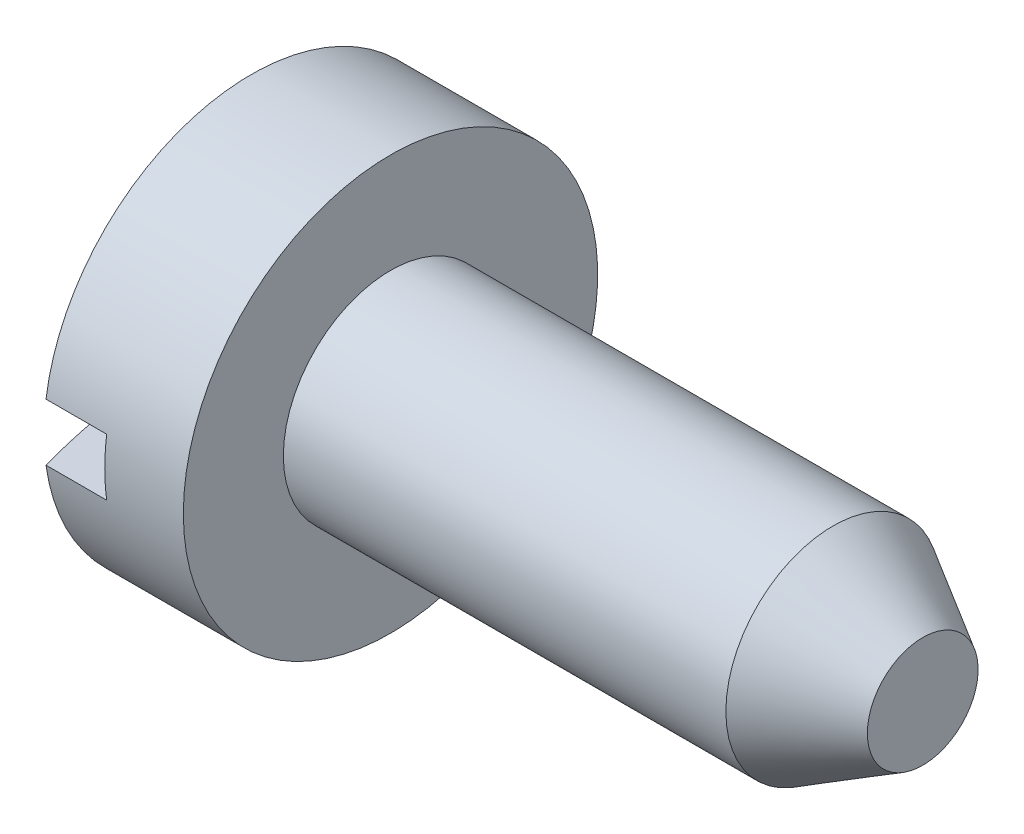
ISO-10303-21;
HEADER;
FILE_DESCRIPTION(('STEP AP214'),'2;1');
FILE_NAME('part.step','',(''),(''),'','','');
FILE_SCHEMA(('AUTOMOTIVE_DESIGN { 1 0 10303 214 1 1 1 1 }'));
ENDSEC;
DATA;
#1=APPLICATION_CONTEXT('core data for automotive mechanical design processes');
#2=APPLICATION_PROTOCOL_DEFINITION('international standard','automotive_design',2000,#1);
#3=PRODUCT_CONTEXT('',#1,'mechanical');
#4=PRODUCT('Part','Part','',(#3));
#5=PRODUCT_RELATED_PRODUCT_CATEGORY('part','',(#4));
#6=PRODUCT_DEFINITION_FORMATION('','',#4);
#7=PRODUCT_DEFINITION_CONTEXT('part definition',#1,'design');
#8=PRODUCT_DEFINITION('design','',#6,#7);
#9=PRODUCT_DEFINITION_SHAPE('','',#8);
#10=(LENGTH_UNIT() NAMED_UNIT(*) SI_UNIT(.MILLI.,.METRE.));
#11=(NAMED_UNIT(*) PLANE_ANGLE_UNIT() SI_UNIT($,.RADIAN.));
#12=(NAMED_UNIT(*) SI_UNIT($,.STERADIAN.) SOLID_ANGLE_UNIT());
#13=UNCERTAINTY_MEASURE_WITH_UNIT(LENGTH_MEASURE(1.E-05),#10,'distance_accuracy_value','');
#14=(GEOMETRIC_REPRESENTATION_CONTEXT(3) GLOBAL_UNCERTAINTY_ASSIGNED_CONTEXT((#13)) GLOBAL_UNIT_ASSIGNED_CONTEXT((#10,
#11,#12)) REPRESENTATION_CONTEXT('',''));
#15=CARTESIAN_POINT('',(0.,0.,0.));
#16=DIRECTION('',(0.,0.,1.));
#17=DIRECTION('',(1.,0.,0.));
#18=AXIS2_PLACEMENT_3D('',#15,#16,#17);
#19=CARTESIAN_POINT('',(0.,0.,0.));
#20=DIRECTION('',(-1.,0.,0.));
#21=DIRECTION('',(0.,0.,1.));
#22=AXIS2_PLACEMENT_3D('',#19,#20,#21);
#23=CYLINDRICAL_SURFACE('',#22,0.762);
#24=CARTESIAN_POINT('',(0.9906,0.,0.));
#25=DIRECTION('',(-1.,0.,0.));
#26=DIRECTION('',(0.,0.,1.));
#27=AXIS2_PLACEMENT_3D('',#24,#25,#26);
#28=CIRCLE('',#27,0.762);
#29=CARTESIAN_POINT('',(0.9906,0.,0.762));
#30=VERTEX_POINT('',#29);
#31=EDGE_CURVE('E130',#30,#30,#28,.T.);
#32=ORIENTED_EDGE('',*,*,#31,.F.);
#33=EDGE_LOOP('',(#32));
#34=FACE_BOUND('',#33,.T.);
#35=CARTESIAN_POINT('',(4.13728568757237,0.,0.));
#36=DIRECTION('',(-1.,0.,0.));
#37=DIRECTION('',(0.,0.,1.));
#38=AXIS2_PLACEMENT_3D('',#35,#36,#37);
#39=CIRCLE('',#38,0.762);
#40=CARTESIAN_POINT('',(4.13728568757237,0.,0.762));
#41=VERTEX_POINT('',#40);
#42=EDGE_CURVE('E180',#41,#41,#39,.T.);
#43=ORIENTED_EDGE('',*,*,#42,.T.);
#44=EDGE_LOOP('',(#43));
#45=FACE_BOUND('',#44,.T.);
#46=ADVANCED_FACE('F68',(#34,#45),#23,.T.);
#47=CARTESIAN_POINT('',(5.23874999999999,0.,0.));
#48=DIRECTION('',(-1.,0.,0.));
#49=DIRECTION('',(0.,1.,0.));
#50=AXIS2_PLACEMENT_3D('',#47,#48,#49);
#51=SPHERICAL_SURFACE('',#50,5.44194999999999);
#52=CARTESIAN_POINT('',(0.,0.,0.));
#53=DIRECTION('',(-1.,0.,0.));
#54=DIRECTION('',(0.,0.,1.));
#55=AXIS2_PLACEMENT_3D('',#52,#53,#54);
#56=CIRCLE('',#55,1.4732);
#57=CARTESIAN_POINT('',(0.,0.2032,1.45911891222066));
#58=VERTEX_POINT('',#57);
#59=CARTESIAN_POINT('',(0.,0.2032,-1.45911891222066));
#60=VERTEX_POINT('',#59);
#61=EDGE_CURVE('E144',#58,#60,#56,.T.);
#62=ORIENTED_EDGE('',*,*,#61,.T.);
#63=CARTESIAN_POINT('',(5.23874999999999,0.2032,0.));
#64=DIRECTION('',(0.,1.,0.));
#65=DIRECTION('',(0.,0.,1.));
#66=AXIS2_PLACEMENT_3D('',#63,#64,#65);
#67=CIRCLE('',#66,5.43815497779347);
#68=EDGE_CURVE('E91',#60,#58,#67,.T.);
#69=ORIENTED_EDGE('',*,*,#68,.T.);
#70=EDGE_LOOP('',(#62,#69));
#71=FACE_BOUND('',#70,.T.);
#72=ADVANCED_FACE('F149',(#71),#51,.T.);
#73=CARTESIAN_POINT('',(0.,-0.2032,-1.45911891222066));
#74=VERTEX_POINT('',#73);
#75=CARTESIAN_POINT('',(0.,-0.2032,1.45911891222066));
#76=VERTEX_POINT('',#75);
#77=EDGE_CURVE('E137',#74,#76,#56,.T.);
#78=ORIENTED_EDGE('',*,*,#77,.T.);
#79=CARTESIAN_POINT('',(5.23874999999999,-0.2032,0.));
#80=DIRECTION('',(0.,-1.,0.));
#81=DIRECTION('',(0.,0.,-1.));
#82=AXIS2_PLACEMENT_3D('',#79,#80,#81);
#83=CIRCLE('',#82,5.43815497779347);
#84=EDGE_CURVE('E110',#76,#74,#83,.T.);
#85=ORIENTED_EDGE('',*,*,#84,.T.);
#86=EDGE_LOOP('',(#78,#85));
#87=FACE_BOUND('',#86,.T.);
#88=ADVANCED_FACE('F70',(#87),#51,.T.);
#89=CARTESIAN_POINT('',(0.9906,0.762,0.));
#90=DIRECTION('',(-1.,0.,0.));
#91=DIRECTION('',(0.,0.,1.));
#92=AXIS2_PLACEMENT_3D('',#89,#90,#91);
#93=PLANE('',#92);
#94=CARTESIAN_POINT('',(0.9906,0.,0.));
#95=DIRECTION('',(-1.,0.,0.));
#96=DIRECTION('',(0.,0.,1.));
#97=AXIS2_PLACEMENT_3D('',#94,#95,#96);
#98=CIRCLE('',#97,1.4732);
#99=CARTESIAN_POINT('',(0.9906,0.,1.4732));
#100=VERTEX_POINT('',#99);
#101=EDGE_CURVE('E133',#100,#100,#98,.T.);
#102=ORIENTED_EDGE('',*,*,#101,.F.);
#103=EDGE_LOOP('',(#102));
#104=FACE_BOUND('',#103,.T.);
#105=ORIENTED_EDGE('',*,*,#31,.T.);
#106=EDGE_LOOP('',(#105));
#107=FACE_BOUND('',#106,.T.);
#108=ADVANCED_FACE('F158',(#104,#107),#93,.F.);
#109=CARTESIAN_POINT('',(0.,0.,0.));
#110=DIRECTION('',(-1.,0.,0.));
#111=DIRECTION('',(0.,0.,1.));
#112=AXIS2_PLACEMENT_3D('',#109,#110,#111);
#113=CYLINDRICAL_SURFACE('',#112,1.4732);
#114=CARTESIAN_POINT('',(0.4318,0.,0.));
#115=DIRECTION('',(1.,0.,0.));
#116=DIRECTION('',(0.,0.,-1.));
#117=AXIS2_PLACEMENT_3D('',#114,#115,#116);
#118=CIRCLE('',#117,1.4732);
#119=CARTESIAN_POINT('',(0.4318,-0.2032,-1.45911891222066));
#120=VERTEX_POINT('',#119);
#121=CARTESIAN_POINT('',(0.4318,0.2032,-1.45911891222066));
#122=VERTEX_POINT('',#121);
#123=EDGE_CURVE('E115',#120,#122,#118,.T.);
#124=ORIENTED_EDGE('',*,*,#123,.T.);
#125=DIRECTION('',(-1.,0.,0.));
#126=VECTOR('',#125,1.);
#127=CARTESIAN_POINT('',(0.,0.2032,-1.45911891222066));
#128=LINE('',#127,#126);
#129=EDGE_CURVE('E42',#122,#60,#128,.T.);
#130=ORIENTED_EDGE('',*,*,#129,.T.);
#131=ORIENTED_EDGE('',*,*,#61,.F.);
#132=DIRECTION('',(-1.,0.,0.));
#133=VECTOR('',#132,1.);
#134=CARTESIAN_POINT('',(0.,0.2032,1.45911891222066));
#135=LINE('',#134,#133);
#136=CARTESIAN_POINT('',(0.4318,0.2032,1.45911891222066));
#137=VERTEX_POINT('',#136);
#138=EDGE_CURVE('E76',#58,#137,#135,.F.);
#139=ORIENTED_EDGE('',*,*,#138,.T.);
#140=CARTESIAN_POINT('',(0.4318,-0.2032,1.45911891222066));
#141=VERTEX_POINT('',#140);
#142=EDGE_CURVE('E116',#137,#141,#118,.T.);
#143=ORIENTED_EDGE('',*,*,#142,.T.);
#144=DIRECTION('',(-1.,0.,0.));
#145=VECTOR('',#144,1.);
#146=CARTESIAN_POINT('',(0.,-0.2032,1.45911891222066));
#147=LINE('',#146,#145);
#148=EDGE_CURVE('E107',#141,#76,#147,.T.);
#149=ORIENTED_EDGE('',*,*,#148,.T.);
#150=ORIENTED_EDGE('',*,*,#77,.F.);
#151=DIRECTION('',(-1.,0.,0.));
#152=VECTOR('',#151,1.);
#153=CARTESIAN_POINT('',(0.,-0.2032,-1.45911891222066));
#154=LINE('',#153,#152);
#155=EDGE_CURVE('E135',#74,#120,#154,.F.);
#156=ORIENTED_EDGE('',*,*,#155,.T.);
#157=EDGE_LOOP('',(#124,#130,#131,#139,#143,#149,#150,#156));
#158=FACE_BOUND('',#157,.T.);
#159=ORIENTED_EDGE('',*,*,#101,.T.);
#160=EDGE_LOOP('',(#159));
#161=FACE_BOUND('',#160,.T.);
#162=ADVANCED_FACE('F127',(#158,#161),#113,.T.);
#163=CARTESIAN_POINT('',(-0.2032,0.2032,-1.4732));
#164=DIRECTION('',(0.,1.,0.));
#165=DIRECTION('',(0.,0.,1.));
#166=AXIS2_PLACEMENT_3D('',#163,#164,#165);
#167=PLANE('',#166);
#168=DIRECTION('',(0.,0.,1.));
#169=VECTOR('',#168,1.);
#170=CARTESIAN_POINT('',(0.4318,0.2032,-1.4732));
#171=LINE('',#170,#169);
#172=EDGE_CURVE('E123',#122,#137,#171,.T.);
#173=ORIENTED_EDGE('',*,*,#172,.T.);
#174=ORIENTED_EDGE('',*,*,#138,.F.);
#175=ORIENTED_EDGE('',*,*,#68,.F.);
#176=ORIENTED_EDGE('',*,*,#129,.F.);
#177=EDGE_LOOP('',(#173,#174,#175,#176));
#178=FACE_BOUND('',#177,.T.);
#179=ADVANCED_FACE('F150',(#178),#167,.F.);
#180=CARTESIAN_POINT('',(0.4318,0.2032,-1.4732));
#181=DIRECTION('',(1.,0.,0.));
#182=DIRECTION('',(0.,0.,-1.));
#183=AXIS2_PLACEMENT_3D('',#180,#181,#182);
#184=PLANE('',#183);
#185=ORIENTED_EDGE('',*,*,#172,.F.);
#186=ORIENTED_EDGE('',*,*,#123,.F.);
#187=DIRECTION('',(0.,0.,1.));
#188=VECTOR('',#187,1.);
#189=CARTESIAN_POINT('',(0.4318,-0.2032,-1.4732));
#190=LINE('',#189,#188);
#191=EDGE_CURVE('E83',#120,#141,#190,.T.);
#192=ORIENTED_EDGE('',*,*,#191,.T.);
#193=ORIENTED_EDGE('',*,*,#142,.F.);
#194=EDGE_LOOP('',(#185,#186,#192,#193));
#195=FACE_BOUND('',#194,.T.);
#196=ADVANCED_FACE('F120',(#195),#184,.F.);
#197=CARTESIAN_POINT('',(-0.2032,-0.2032,-1.4732));
#198=DIRECTION('',(0.,-1.,0.));
#199=DIRECTION('',(0.,0.,-1.));
#200=AXIS2_PLACEMENT_3D('',#197,#198,#199);
#201=PLANE('',#200);
#202=ORIENTED_EDGE('',*,*,#191,.F.);
#203=ORIENTED_EDGE('',*,*,#155,.F.);
#204=ORIENTED_EDGE('',*,*,#84,.F.);
#205=ORIENTED_EDGE('',*,*,#148,.F.);
#206=EDGE_LOOP('',(#202,#203,#204,#205));
#207=FACE_BOUND('',#206,.T.);
#208=ADVANCED_FACE('F108',(#207),#201,.F.);
#209=CARTESIAN_POINT('',(4.13728568757237,0.,0.));
#210=DIRECTION('',(-1.,0.,0.));
#211=DIRECTION('',(0.,0.,1.));
#212=AXIS2_PLACEMENT_3D('',#209,#210,#211);
#213=CONICAL_SURFACE('',#212,0.762,0.523598775598293);
#214=CARTESIAN_POINT('',(4.7752,0.,0.));
#215=DIRECTION('',(-1.,0.,0.));
#216=DIRECTION('',(0.,0.,1.));
#217=AXIS2_PLACEMENT_3D('',#214,#215,#216);
#218=CIRCLE('',#217,0.3937);
#219=CARTESIAN_POINT('',(4.7752,0.,0.3937));
#220=VERTEX_POINT('',#219);
#221=EDGE_CURVE('E124',#220,#220,#218,.T.);
#222=ORIENTED_EDGE('',*,*,#221,.T.);
#223=EDGE_LOOP('',(#222));
#224=FACE_BOUND('',#223,.T.);
#225=ORIENTED_EDGE('',*,*,#42,.F.);
#226=EDGE_LOOP('',(#225));
#227=FACE_BOUND('',#226,.T.);
#228=ADVANCED_FACE('F172',(#224,#227),#213,.T.);
#229=CARTESIAN_POINT('',(4.7752,0.762,0.));
#230=DIRECTION('',(-1.,0.,0.));
#231=DIRECTION('',(0.,0.,1.));
#232=AXIS2_PLACEMENT_3D('',#229,#230,#231);
#233=PLANE('',#232);
#234=ORIENTED_EDGE('',*,*,#221,.F.);
#235=EDGE_LOOP('',(#234));
#236=FACE_BOUND('',#235,.T.);
#237=ADVANCED_FACE('F170',(#236),#233,.F.);
#238=CLOSED_SHELL('',(#46,#72,#88,#108,#162,#179,#196,#208,#228,#237));
#239=MANIFOLD_SOLID_BREP('B6',#238);
#240=ADVANCED_BREP_SHAPE_REPRESENTATION('',(#18,#239),#14);
#241=SHAPE_DEFINITION_REPRESENTATION(#9,#240);
ENDSEC;
END-ISO-10303-21;
